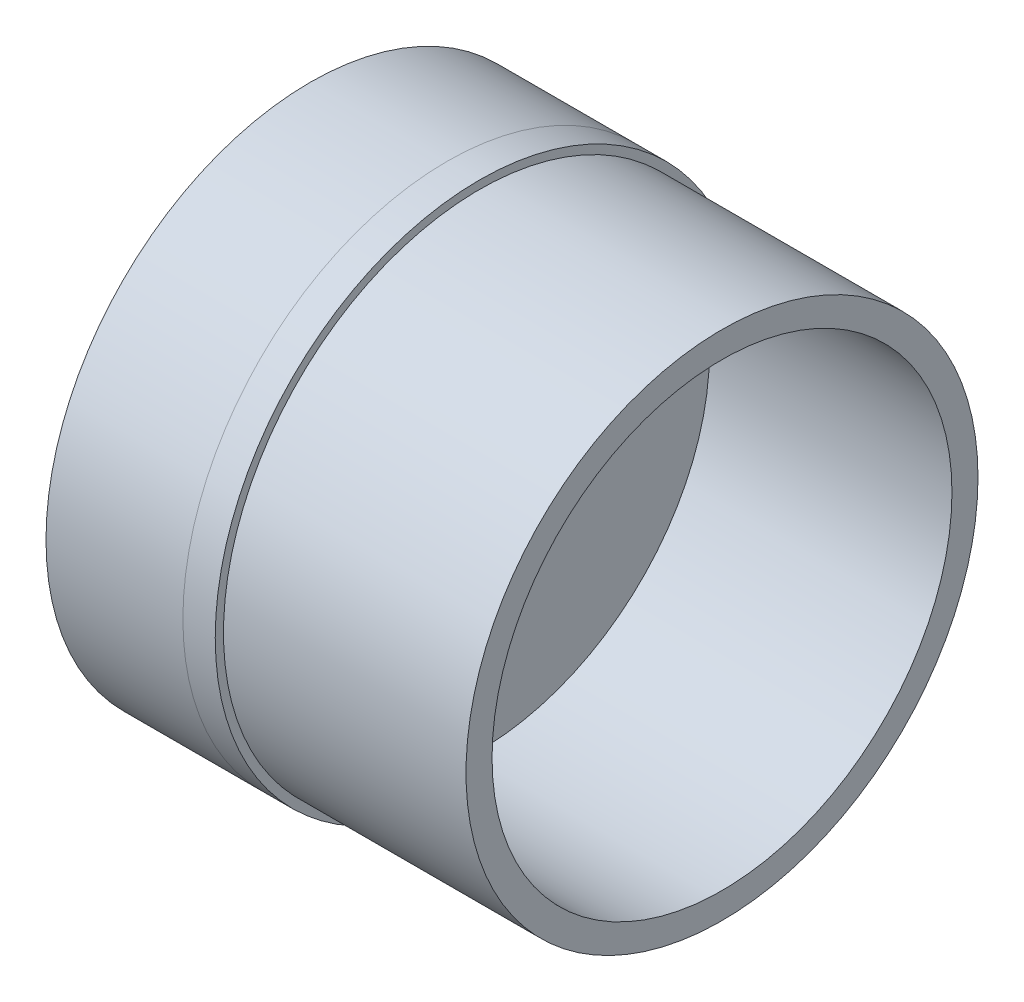
ISO-10303-21;
HEADER;
FILE_DESCRIPTION(('STEP AP214'),'2;1');
FILE_NAME('part.step','',(''),(''),'','','');
FILE_SCHEMA(('AUTOMOTIVE_DESIGN { 1 0 10303 214 1 1 1 1 }'));
ENDSEC;
DATA;
#1=APPLICATION_CONTEXT('core data for automotive mechanical design processes');
#2=APPLICATION_PROTOCOL_DEFINITION('international standard','automotive_design',2000,#1);
#3=PRODUCT_CONTEXT('',#1,'mechanical');
#4=PRODUCT('Part','Part','',(#3));
#5=PRODUCT_RELATED_PRODUCT_CATEGORY('part','',(#4));
#6=PRODUCT_DEFINITION_FORMATION('','',#4);
#7=PRODUCT_DEFINITION_CONTEXT('part definition',#1,'design');
#8=PRODUCT_DEFINITION('design','',#6,#7);
#9=PRODUCT_DEFINITION_SHAPE('','',#8);
#10=(LENGTH_UNIT() NAMED_UNIT(*) SI_UNIT(.MILLI.,.METRE.));
#11=(NAMED_UNIT(*) PLANE_ANGLE_UNIT() SI_UNIT($,.RADIAN.));
#12=(NAMED_UNIT(*) SI_UNIT($,.STERADIAN.) SOLID_ANGLE_UNIT());
#13=UNCERTAINTY_MEASURE_WITH_UNIT(LENGTH_MEASURE(1.E-05),#10,'distance_accuracy_value','');
#14=(GEOMETRIC_REPRESENTATION_CONTEXT(3) GLOBAL_UNCERTAINTY_ASSIGNED_CONTEXT((#13)) GLOBAL_UNIT_ASSIGNED_CONTEXT((#10,
#11,#12)) REPRESENTATION_CONTEXT('',''));
#15=CARTESIAN_POINT('',(0.,0.,0.));
#16=DIRECTION('',(0.,0.,1.));
#17=DIRECTION('',(1.,0.,0.));
#18=AXIS2_PLACEMENT_3D('',#15,#16,#17);
#19=CARTESIAN_POINT('',(-31.4,0.,0.));
#20=DIRECTION('',(-1.,0.,0.));
#21=DIRECTION('',(0.,0.,1.));
#22=AXIS2_PLACEMENT_3D('',#19,#20,#21);
#23=PLANE('',#22);
#24=CARTESIAN_POINT('',(-31.4,0.,0.));
#25=DIRECTION('',(-1.,0.,0.));
#26=DIRECTION('',(0.,0.,1.));
#27=AXIS2_PLACEMENT_3D('',#24,#25,#26);
#28=CIRCLE('',#27,49.03);
#29=CARTESIAN_POINT('',(-31.4,0.,49.03));
#30=VERTEX_POINT('',#29);
#31=EDGE_CURVE('E11',#30,#30,#28,.T.);
#32=ORIENTED_EDGE('',*,*,#31,.T.);
#33=EDGE_LOOP('',(#32));
#34=FACE_BOUND('',#33,.T.);
#35=CARTESIAN_POINT('',(-31.4,0.,0.));
#36=DIRECTION('',(-1.,0.,0.));
#37=DIRECTION('',(0.,0.,1.));
#38=AXIS2_PLACEMENT_3D('',#35,#36,#37);
#39=CIRCLE('',#38,5.);
#40=CARTESIAN_POINT('',(-31.4,0.,5.));
#41=VERTEX_POINT('',#40);
#42=EDGE_CURVE('E62',#41,#41,#39,.T.);
#43=ORIENTED_EDGE('',*,*,#42,.F.);
#44=EDGE_LOOP('',(#43));
#45=FACE_BOUND('',#44,.T.);
#46=ADVANCED_FACE('F51',(#34,#45),#23,.T.);
#47=CARTESIAN_POINT('',(-6.,0.,0.));
#48=DIRECTION('',(-1.,0.,0.));
#49=DIRECTION('',(0.,0.,1.));
#50=AXIS2_PLACEMENT_3D('',#47,#48,#49);
#51=PLANE('',#50);
#52=CARTESIAN_POINT('',(-6.,0.,0.));
#53=DIRECTION('',(-1.,0.,0.));
#54=DIRECTION('',(0.,0.,1.));
#55=AXIS2_PLACEMENT_3D('',#52,#53,#54);
#56=CIRCLE('',#55,49.03);
#57=CARTESIAN_POINT('',(-6.,0.,49.03));
#58=VERTEX_POINT('',#57);
#59=EDGE_CURVE('E55',#58,#58,#56,.T.);
#60=ORIENTED_EDGE('',*,*,#59,.F.);
#61=EDGE_LOOP('',(#60));
#62=FACE_BOUND('',#61,.T.);
#63=CARTESIAN_POINT('',(-6.,0.,0.));
#64=DIRECTION('',(-1.,0.,0.));
#65=DIRECTION('',(0.,0.,1.));
#66=AXIS2_PLACEMENT_3D('',#63,#64,#65);
#67=CIRCLE('',#66,5.);
#68=CARTESIAN_POINT('',(-6.,0.,5.));
#69=VERTEX_POINT('',#68);
#70=EDGE_CURVE('E64',#69,#69,#67,.T.);
#71=ORIENTED_EDGE('',*,*,#70,.T.);
#72=EDGE_LOOP('',(#71));
#73=FACE_BOUND('',#72,.T.);
#74=ADVANCED_FACE('F74',(#62,#73),#51,.F.);
#75=CARTESIAN_POINT('',(-31.4,0.,0.));
#76=DIRECTION('',(1.,0.,0.));
#77=DIRECTION('',(0.,0.,-1.));
#78=AXIS2_PLACEMENT_3D('',#75,#76,#77);
#79=CYLINDRICAL_SURFACE('',#78,49.03);
#80=ORIENTED_EDGE('',*,*,#31,.F.);
#81=EDGE_LOOP('',(#80));
#82=FACE_BOUND('',#81,.T.);
#83=ORIENTED_EDGE('',*,*,#59,.T.);
#84=EDGE_LOOP('',(#83));
#85=FACE_BOUND('',#84,.T.);
#86=ADVANCED_FACE('F53',(#82,#85),#79,.T.);
#87=CARTESIAN_POINT('',(-31.4,0.,0.));
#88=DIRECTION('',(1.,0.,0.));
#89=DIRECTION('',(0.,0.,-1.));
#90=AXIS2_PLACEMENT_3D('',#87,#88,#89);
#91=CYLINDRICAL_SURFACE('',#90,5.);
#92=ORIENTED_EDGE('',*,*,#42,.T.);
#93=EDGE_LOOP('',(#92));
#94=FACE_BOUND('',#93,.T.);
#95=ORIENTED_EDGE('',*,*,#70,.F.);
#96=EDGE_LOOP('',(#95));
#97=FACE_BOUND('',#96,.T.);
#98=ADVANCED_FACE('F70',(#94,#97),#91,.F.);
#99=CLOSED_SHELL('',(#46,#74,#86,#98));
#100=MANIFOLD_SOLID_BREP('B2',#99);
#101=CARTESIAN_POINT('',(-6.,0.,0.));
#102=DIRECTION('',(1.,0.,0.));
#103=DIRECTION('',(0.,0.,-1.));
#104=AXIS2_PLACEMENT_3D('',#101,#102,#103);
#105=PLANE('',#104);
#106=CARTESIAN_POINT('',(-6.,0.,0.));
#107=DIRECTION('',(1.,0.,0.));
#108=DIRECTION('',(0.,0.,-1.));
#109=AXIS2_PLACEMENT_3D('',#106,#107,#108);
#110=CIRCLE('',#109,49.03);
#111=CARTESIAN_POINT('',(-6.,0.,-49.03));
#112=VERTEX_POINT('',#111);
#113=EDGE_CURVE('E143',#112,#112,#110,.T.);
#114=ORIENTED_EDGE('',*,*,#113,.F.);
#115=EDGE_LOOP('',(#114));
#116=FACE_BOUND('',#115,.T.);
#117=CARTESIAN_POINT('',(-6.,0.,0.));
#118=DIRECTION('',(1.,0.,0.));
#119=DIRECTION('',(0.,0.,-1.));
#120=AXIS2_PLACEMENT_3D('',#117,#118,#119);
#121=CIRCLE('',#120,5.);
#122=CARTESIAN_POINT('',(-6.,0.,-5.));
#123=VERTEX_POINT('',#122);
#124=EDGE_CURVE('E138',#123,#123,#121,.T.);
#125=ORIENTED_EDGE('',*,*,#124,.T.);
#126=EDGE_LOOP('',(#125));
#127=FACE_BOUND('',#126,.T.);
#128=ADVANCED_FACE('F113',(#116,#127),#105,.F.);
#129=CARTESIAN_POINT('',(0.,0.,0.));
#130=DIRECTION('',(1.,0.,0.));
#131=DIRECTION('',(0.,0.,-1.));
#132=AXIS2_PLACEMENT_3D('',#129,#130,#131);
#133=CYLINDRICAL_SURFACE('',#132,49.03);
#134=ORIENTED_EDGE('',*,*,#113,.T.);
#135=EDGE_LOOP('',(#134));
#136=FACE_BOUND('',#135,.T.);
#137=CARTESIAN_POINT('',(0.,0.,0.));
#138=DIRECTION('',(1.,0.,0.));
#139=DIRECTION('',(0.,0.,-1.));
#140=AXIS2_PLACEMENT_3D('',#137,#138,#139);
#141=CIRCLE('',#140,49.03);
#142=CARTESIAN_POINT('',(0.,0.,-49.03));
#143=VERTEX_POINT('',#142);
#144=EDGE_CURVE('E126',#143,#143,#141,.T.);
#145=ORIENTED_EDGE('',*,*,#144,.F.);
#146=EDGE_LOOP('',(#145));
#147=FACE_BOUND('',#146,.T.);
#148=ADVANCED_FACE('F152',(#136,#147),#133,.T.);
#149=CARTESIAN_POINT('',(0.,0.,0.));
#150=DIRECTION('',(1.,0.,0.));
#151=DIRECTION('',(0.,0.,-1.));
#152=AXIS2_PLACEMENT_3D('',#149,#150,#151);
#153=PLANE('',#152);
#154=CARTESIAN_POINT('',(0.,0.,0.));
#155=DIRECTION('',(1.,0.,0.));
#156=DIRECTION('',(0.,0.,-1.));
#157=AXIS2_PLACEMENT_3D('',#154,#155,#156);
#158=CIRCLE('',#157,47.5);
#159=CARTESIAN_POINT('',(0.,0.,-47.5));
#160=VERTEX_POINT('',#159);
#161=EDGE_CURVE('E121',#160,#160,#158,.F.);
#162=ORIENTED_EDGE('',*,*,#161,.T.);
#163=EDGE_LOOP('',(#162));
#164=FACE_BOUND('',#163,.T.);
#165=ORIENTED_EDGE('',*,*,#144,.T.);
#166=EDGE_LOOP('',(#165));
#167=FACE_BOUND('',#166,.T.);
#168=ADVANCED_FACE('F150',(#164,#167),#153,.T.);
#169=CARTESIAN_POINT('',(0.,0.,0.));
#170=DIRECTION('',(1.,0.,0.));
#171=DIRECTION('',(0.,0.,-1.));
#172=AXIS2_PLACEMENT_3D('',#169,#170,#171);
#173=CYLINDRICAL_SURFACE('',#172,5.00000000000001);
#174=CARTESIAN_POINT('',(0.,0.,0.));
#175=DIRECTION('',(1.,0.,0.));
#176=DIRECTION('',(0.,0.,-1.));
#177=AXIS2_PLACEMENT_3D('',#174,#175,#176);
#178=CIRCLE('',#177,5.00000000000001);
#179=CARTESIAN_POINT('',(0.,0.,-5.00000000000001));
#180=VERTEX_POINT('',#179);
#181=EDGE_CURVE('E134',#180,#180,#178,.T.);
#182=ORIENTED_EDGE('',*,*,#181,.T.);
#183=EDGE_LOOP('',(#182));
#184=FACE_BOUND('',#183,.T.);
#185=ORIENTED_EDGE('',*,*,#124,.F.);
#186=EDGE_LOOP('',(#185));
#187=FACE_BOUND('',#186,.T.);
#188=ADVANCED_FACE('F160',(#184,#187),#173,.F.);
#189=ORIENTED_EDGE('',*,*,#181,.F.);
#190=EDGE_LOOP('',(#189));
#191=FACE_BOUND('',#190,.T.);
#192=CARTESIAN_POINT('',(0.,0.,0.));
#193=DIRECTION('',(1.,0.,0.));
#194=DIRECTION('',(0.,0.,-1.));
#195=AXIS2_PLACEMENT_3D('',#192,#193,#194);
#196=CIRCLE('',#195,42.6688311688312);
#197=CARTESIAN_POINT('',(0.,0.,-42.6688311688312));
#198=VERTEX_POINT('',#197);
#199=EDGE_CURVE('E50',#198,#198,#196,.F.);
#200=ORIENTED_EDGE('',*,*,#199,.F.);
#201=EDGE_LOOP('',(#200));
#202=FACE_BOUND('',#201,.T.);
#203=ADVANCED_FACE('F163',(#191,#202),#153,.T.);
#204=CARTESIAN_POINT('',(45.,47.5,0.));
#205=DIRECTION('',(-1.,0.,0.));
#206=DIRECTION('',(0.,0.,1.));
#207=AXIS2_PLACEMENT_3D('',#204,#205,#206);
#208=PLANE('',#207);
#209=CARTESIAN_POINT('',(45.,0.,0.));
#210=DIRECTION('',(1.,0.,0.));
#211=DIRECTION('',(0.,0.,-1.));
#212=AXIS2_PLACEMENT_3D('',#209,#210,#211);
#213=CIRCLE('',#212,42.6688311688312);
#214=CARTESIAN_POINT('',(45.,0.,-42.6688311688312));
#215=VERTEX_POINT('',#214);
#216=EDGE_CURVE('E117',#215,#215,#213,.T.);
#217=ORIENTED_EDGE('',*,*,#216,.F.);
#218=EDGE_LOOP('',(#217));
#219=FACE_BOUND('',#218,.T.);
#220=CARTESIAN_POINT('',(45.,0.,0.));
#221=DIRECTION('',(1.,0.,0.));
#222=DIRECTION('',(0.,0.,-1.));
#223=AXIS2_PLACEMENT_3D('',#220,#221,#222);
#224=CIRCLE('',#223,47.5);
#225=CARTESIAN_POINT('',(45.,0.,-47.5));
#226=VERTEX_POINT('',#225);
#227=EDGE_CURVE('E129',#226,#226,#224,.T.);
#228=ORIENTED_EDGE('',*,*,#227,.T.);
#229=EDGE_LOOP('',(#228));
#230=FACE_BOUND('',#229,.T.);
#231=ADVANCED_FACE('F170',(#219,#230),#208,.F.);
#232=CARTESIAN_POINT('',(0.,0.,0.));
#233=DIRECTION('',(1.,0.,0.));
#234=DIRECTION('',(0.,0.,-1.));
#235=AXIS2_PLACEMENT_3D('',#232,#233,#234);
#236=CYLINDRICAL_SURFACE('',#235,47.5);
#237=ORIENTED_EDGE('',*,*,#227,.F.);
#238=EDGE_LOOP('',(#237));
#239=FACE_BOUND('',#238,.T.);
#240=ORIENTED_EDGE('',*,*,#161,.F.);
#241=EDGE_LOOP('',(#240));
#242=FACE_BOUND('',#241,.T.);
#243=ADVANCED_FACE('F168',(#239,#242),#236,.T.);
#244=CARTESIAN_POINT('',(0.,0.,0.));
#245=DIRECTION('',(1.,0.,0.));
#246=DIRECTION('',(0.,0.,-1.));
#247=AXIS2_PLACEMENT_3D('',#244,#245,#246);
#248=CYLINDRICAL_SURFACE('',#247,42.6688311688312);
#249=ORIENTED_EDGE('',*,*,#216,.T.);
#250=EDGE_LOOP('',(#249));
#251=FACE_BOUND('',#250,.T.);
#252=ORIENTED_EDGE('',*,*,#199,.T.);
#253=EDGE_LOOP('',(#252));
#254=FACE_BOUND('',#253,.T.);
#255=ADVANCED_FACE('F115',(#251,#254),#248,.F.);
#256=CLOSED_SHELL('',(#128,#148,#168,#188,#203,#231,#243,#255));
#257=MANIFOLD_SOLID_BREP('B6',#256);
#258=ADVANCED_BREP_SHAPE_REPRESENTATION('',(#18,#100,#257),#14);
#259=SHAPE_DEFINITION_REPRESENTATION(#9,#258);
ENDSEC;
END-ISO-10303-21;
